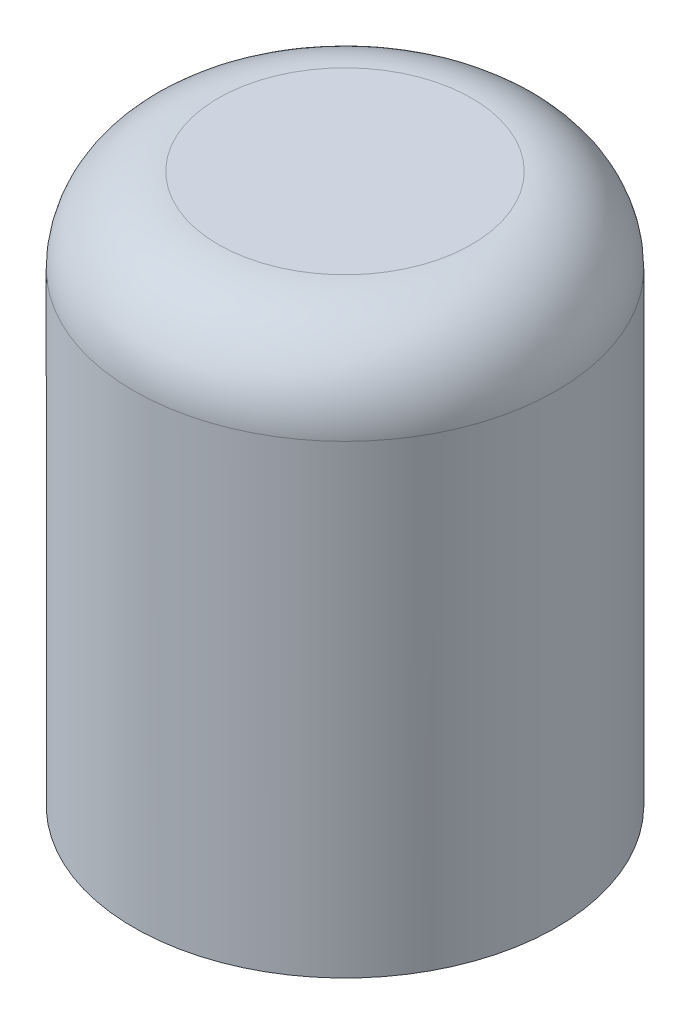
ISO-10303-21;
HEADER;
FILE_DESCRIPTION(('STEP AP214'),'2;1');
FILE_NAME('part.step','',(''),(''),'','','');
FILE_SCHEMA(('AUTOMOTIVE_DESIGN { 1 0 10303 214 1 1 1 1 }'));
ENDSEC;
DATA;
#1=APPLICATION_CONTEXT('core data for automotive mechanical design processes');
#2=APPLICATION_PROTOCOL_DEFINITION('international standard','automotive_design',2000,#1);
#3=PRODUCT_CONTEXT('',#1,'mechanical');
#4=PRODUCT('Part','Part','',(#3));
#5=PRODUCT_RELATED_PRODUCT_CATEGORY('part','',(#4));
#6=PRODUCT_DEFINITION_FORMATION('','',#4);
#7=PRODUCT_DEFINITION_CONTEXT('part definition',#1,'design');
#8=PRODUCT_DEFINITION('design','',#6,#7);
#9=PRODUCT_DEFINITION_SHAPE('','',#8);
#10=(LENGTH_UNIT() NAMED_UNIT(*) SI_UNIT(.MILLI.,.METRE.));
#11=(NAMED_UNIT(*) PLANE_ANGLE_UNIT() SI_UNIT($,.RADIAN.));
#12=(NAMED_UNIT(*) SI_UNIT($,.STERADIAN.) SOLID_ANGLE_UNIT());
#13=UNCERTAINTY_MEASURE_WITH_UNIT(LENGTH_MEASURE(1.E-05),#10,'distance_accuracy_value','');
#14=(GEOMETRIC_REPRESENTATION_CONTEXT(3) GLOBAL_UNCERTAINTY_ASSIGNED_CONTEXT((#13)) GLOBAL_UNIT_ASSIGNED_CONTEXT((#10,
#11,#12)) REPRESENTATION_CONTEXT('',''));
#15=CARTESIAN_POINT('',(0.,0.,0.));
#16=DIRECTION('',(0.,0.,1.));
#17=DIRECTION('',(1.,0.,0.));
#18=AXIS2_PLACEMENT_3D('',#15,#16,#17);
#19=CARTESIAN_POINT('',(0.,11.,0.));
#20=DIRECTION('',(0.,1.,0.));
#21=DIRECTION('',(0.,0.,1.));
#22=AXIS2_PLACEMENT_3D('',#19,#20,#21);
#23=TOROIDAL_SURFACE('',#22,3.,2.);
#24=CARTESIAN_POINT('',(0.,13.,0.));
#25=DIRECTION('',(0.,1.,0.));
#26=DIRECTION('',(0.,0.,1.));
#27=AXIS2_PLACEMENT_3D('',#24,#25,#26);
#28=CIRCLE('',#27,3.);
#29=CARTESIAN_POINT('',(0.,13.,3.));
#30=VERTEX_POINT('',#29);
#31=EDGE_CURVE('E40',#30,#30,#28,.T.);
#32=ORIENTED_EDGE('',*,*,#31,.F.);
#33=EDGE_LOOP('',(#32));
#34=FACE_BOUND('',#33,.T.);
#35=CARTESIAN_POINT('',(0.,11.,0.));
#36=DIRECTION('',(0.,1.,0.));
#37=DIRECTION('',(0.,0.,1.));
#38=AXIS2_PLACEMENT_3D('',#35,#36,#37);
#39=CIRCLE('',#38,5.);
#40=CARTESIAN_POINT('',(0.,11.,-5.));
#41=VERTEX_POINT('',#40);
#42=EDGE_CURVE('E11',#41,#41,#39,.F.);
#43=ORIENTED_EDGE('',*,*,#42,.F.);
#44=EDGE_LOOP('',(#43));
#45=FACE_BOUND('',#44,.T.);
#46=ADVANCED_FACE('F33',(#34,#45),#23,.T.);
#47=CARTESIAN_POINT('',(0.,0.5,0.));
#48=DIRECTION('',(0.,1.,0.));
#49=DIRECTION('',(0.,0.,1.));
#50=AXIS2_PLACEMENT_3D('',#47,#48,#49);
#51=TOROIDAL_SURFACE('',#50,3.75,0.5);
#52=CARTESIAN_POINT('',(-1.75,0.5,-2.73861278752583));
#53=CARTESIAN_POINT('',(-1.7499674824481,0.474278837361454,-2.73859259790002));
#54=CARTESIAN_POINT('',(-1.75198237506451,0.448586345650578,-2.73969859620781));
#55=CARTESIAN_POINT('',(-1.75984312267766,0.398079901109395,-2.74400024533714));
#56=CARTESIAN_POINT('',(-1.76567297405102,0.373262732662912,-2.74718716663568));
#57=CARTESIAN_POINT('',(-1.78089732230707,0.325121956256528,-2.75548689059487));
#58=CARTESIAN_POINT('',(-1.79028883460707,0.30179711683594,-2.76059808074036));
#59=CARTESIAN_POINT('',(-1.81223505767192,0.25713980788578,-2.77249719754774));
#60=CARTESIAN_POINT('',(-1.82479229547402,0.235808948784772,-2.7792864636469));
#61=CARTESIAN_POINT('',(-1.85332454478459,0.194533583680187,-2.79464403087261));
#62=CARTESIAN_POINT('',(-1.86944038713963,0.174713912089738,-2.80328498984528));
#63=CARTESIAN_POINT('',(-1.90413868768371,0.138036031663502,-2.82179051623727));
#64=CARTESIAN_POINT('',(-1.92272186476392,0.121178689281027,-2.83165544022016));
#65=CARTESIAN_POINT('',(-1.96413552071173,0.0888438232670606,-2.85351348382649));
#66=CARTESIAN_POINT('',(-1.98720861684694,0.0737543212637763,-2.86562069702042));
#67=CARTESIAN_POINT('',(-2.0351853803325,0.0476715458813287,-2.89062495299089));
#68=CARTESIAN_POINT('',(-2.06009049046738,0.0366815432797199,-2.90352261691614));
#69=CARTESIAN_POINT('',(-2.11141723205832,0.0188117444425454,-2.92991945103525));
#70=CARTESIAN_POINT('',(-2.13785298735995,0.0119805652929461,-2.94342382558038));
#71=CARTESIAN_POINT('',(-2.1913643035036,0.00271071457912047,-2.97056837485435));
#72=CARTESIAN_POINT('',(-2.21843834900099,0.00026252908381243,-2.98420819066613));
#73=CARTESIAN_POINT('',(-2.24701876895388,6.65253664002436E-06,-2.99850910914954));
#74=CARTESIAN_POINT('',(-2.24850938818204,-1.45989664626208E-08,-2.99925469676851));
#75=CARTESIAN_POINT('',(-2.25,0.,-3.));
#76=B_SPLINE_CURVE_WITH_KNOTS('',3,(#52,#53,#54,#55,#56,#57,#58,#59,#60,#61,#62,#63,#64,#65,#66,
#67,#68,#69,#70,#71,#72,#73,#74,#75),.UNSPECIFIED.,.F.,.F.,(4,2,2,2,2,2,2,2,2,2,2,4),(0.,
0.0770159881493257,0.153710950261179,0.230341785415904,0.307033985825627,0.387608331550511,
0.46820620542566,0.558170639044782,0.648206697860432,0.739276030919878,0.830147443841168,
0.835147483886677),.UNSPECIFIED.);
#77=CARTESIAN_POINT('',(-2.25,0.,-3.));
#78=VERTEX_POINT('',#77);
#79=CARTESIAN_POINT('',(-1.75,0.5,-2.73861278752583));
#80=VERTEX_POINT('',#79);
#81=EDGE_CURVE('E55',#78,#80,#76,.F.);
#82=ORIENTED_EDGE('',*,*,#81,.F.);
#83=CARTESIAN_POINT('',(0.,0.,0.));
#84=DIRECTION('',(0.,1.,0.));
#85=DIRECTION('',(0.,0.,1.));
#86=AXIS2_PLACEMENT_3D('',#83,#84,#85);
#87=CIRCLE('',#86,3.75);
#88=CARTESIAN_POINT('',(-2.25,0.,3.));
#89=VERTEX_POINT('',#88);
#90=EDGE_CURVE('E85',#89,#78,#87,.T.);
#91=ORIENTED_EDGE('',*,*,#90,.F.);
#92=CARTESIAN_POINT('',(-1.75,0.5,2.73861278752583));
#93=CARTESIAN_POINT('',(-1.7499674824481,0.474278837361454,2.73859259790002));
#94=CARTESIAN_POINT('',(-1.75198237506451,0.448586345650578,2.73969859620781));
#95=CARTESIAN_POINT('',(-1.75984312267766,0.398079901109395,2.74400024533714));
#96=CARTESIAN_POINT('',(-1.76567297405102,0.373262732662912,2.74718716663568));
#97=CARTESIAN_POINT('',(-1.78089732230707,0.325121956256528,2.75548689059487));
#98=CARTESIAN_POINT('',(-1.79028883460707,0.30179711683594,2.76059808074036));
#99=CARTESIAN_POINT('',(-1.81223505767192,0.25713980788578,2.77249719754774));
#100=CARTESIAN_POINT('',(-1.82479229547402,0.235808948784772,2.7792864636469));
#101=CARTESIAN_POINT('',(-1.85332454478459,0.194533583680187,2.79464403087261));
#102=CARTESIAN_POINT('',(-1.86944038713963,0.174713912089738,2.80328498984528));
#103=CARTESIAN_POINT('',(-1.90413868768371,0.138036031663502,2.82179051623727));
#104=CARTESIAN_POINT('',(-1.92272186476392,0.121178689281027,2.83165544022016));
#105=CARTESIAN_POINT('',(-1.96413552071173,0.0888438232670606,2.85351348382649));
#106=CARTESIAN_POINT('',(-1.98720861684694,0.0737543212637763,2.86562069702042));
#107=CARTESIAN_POINT('',(-2.0351853803325,0.0476715458813287,2.89062495299089));
#108=CARTESIAN_POINT('',(-2.06009049046738,0.0366815432797199,2.90352261691614));
#109=CARTESIAN_POINT('',(-2.11141723205832,0.0188117444425454,2.92991945103525));
#110=CARTESIAN_POINT('',(-2.13785298735995,0.0119805652929461,2.94342382558038));
#111=CARTESIAN_POINT('',(-2.1913643035036,0.00271071457912047,2.97056837485435));
#112=CARTESIAN_POINT('',(-2.21843834900099,0.00026252908381243,2.98420819066613));
#113=CARTESIAN_POINT('',(-2.24701876895388,6.65253664002436E-06,2.99850910914954));
#114=CARTESIAN_POINT('',(-2.24850938818204,-1.45989664626208E-08,2.99925469676851));
#115=CARTESIAN_POINT('',(-2.25,0.,3.));
#116=B_SPLINE_CURVE_WITH_KNOTS('',3,(#92,#93,#94,#95,#96,#97,#98,#99,#100,#101,#102,#103,#104,
#105,#106,#107,#108,#109,#110,#111,#112,#113,#114,#115),.UNSPECIFIED.,.F.,.F.,(4,2,2,2,2,2,2,2,
2,2,2,4),(0.,0.0770159881493257,0.153710950261179,0.230341785415904,0.307033985825627,
0.387608331550511,0.46820620542566,0.558170639044782,0.648206697860432,0.739276030919878,
0.830147443841168,0.835147483886677),.UNSPECIFIED.);
#117=CARTESIAN_POINT('',(-1.75,0.5,2.73861278752583));
#118=VERTEX_POINT('',#117);
#119=EDGE_CURVE('E47',#89,#118,#116,.F.);
#120=ORIENTED_EDGE('',*,*,#119,.T.);
#121=CARTESIAN_POINT('',(0.,0.5,0.));
#122=DIRECTION('',(0.,1.,0.));
#123=DIRECTION('',(0.,0.,1.));
#124=AXIS2_PLACEMENT_3D('',#121,#122,#123);
#125=CIRCLE('',#124,3.25);
#126=EDGE_CURVE('E105',#80,#118,#125,.F.);
#127=ORIENTED_EDGE('',*,*,#126,.F.);
#128=EDGE_LOOP('',(#82,#91,#120,#127));
#129=FACE_BOUND('',#128,.T.);
#130=ADVANCED_FACE('F128',(#129),#51,.T.);
#131=CARTESIAN_POINT('',(-2.25,0.5,0.));
#132=DIRECTION('',(0.,0.,1.));
#133=DIRECTION('',(1.,0.,0.));
#134=AXIS2_PLACEMENT_3D('',#131,#132,#133);
#135=CYLINDRICAL_SURFACE('',#134,0.5);
#136=DIRECTION('',(0.,0.,1.));
#137=VECTOR('',#136,1.);
#138=CARTESIAN_POINT('',(-2.25,0.,0.));
#139=LINE('',#138,#137);
#140=EDGE_CURVE('E241',#78,#89,#139,.T.);
#141=ORIENTED_EDGE('',*,*,#140,.F.);
#142=ORIENTED_EDGE('',*,*,#81,.T.);
#143=DIRECTION('',(0.,0.,1.));
#144=VECTOR('',#143,1.);
#145=CARTESIAN_POINT('',(-1.75,0.5,2.73861278752583));
#146=LINE('',#145,#144);
#147=EDGE_CURVE('E242',#118,#80,#146,.F.);
#148=ORIENTED_EDGE('',*,*,#147,.F.);
#149=ORIENTED_EDGE('',*,*,#119,.F.);
#150=EDGE_LOOP('',(#141,#142,#148,#149));
#151=FACE_BOUND('',#150,.T.);
#152=ADVANCED_FACE('F127',(#151),#135,.T.);
#153=CARTESIAN_POINT('',(0.25,10.,2.73861278752583));
#154=DIRECTION('',(0.,0.,1.));
#155=DIRECTION('',(1.,0.,0.));
#156=AXIS2_PLACEMENT_3D('',#153,#154,#155);
#157=CYLINDRICAL_SURFACE('',#156,2.);
#158=CARTESIAN_POINT('',(-1.75,10.,2.73861278752583));
#159=CARTESIAN_POINT('',(-1.75000816912058,10.0507790307986,2.73861468583138));
#160=CARTESIAN_POINT('',(-1.74806629696918,10.1015541531402,2.73755358747773));
#161=CARTESIAN_POINT('',(-1.74034467667038,10.2027120285179,2.73332073449254));
#162=CARTESIAN_POINT('',(-1.73456579461389,10.2530948675043,2.73014945617105));
#163=CARTESIAN_POINT('',(-1.71925648862986,10.3529491670645,2.72172487337152));
#164=CARTESIAN_POINT('',(-1.70973795382558,10.4024230008178,2.71647816674781));
#165=CARTESIAN_POINT('',(-1.68707759421614,10.5002555603041,2.70393632748552));
#166=CARTESIAN_POINT('',(-1.6739356944156,10.548614262934,2.69664115244826));
#167=CARTESIAN_POINT('',(-1.62930393841335,10.691475721789,2.67173957516339));
#168=CARTESIAN_POINT('',(-1.59258791588586,10.7838922129445,2.65110627863707));
#169=CARTESIAN_POINT('',(-1.50694306106797,10.9606354500445,2.6021960978917));
#170=CARTESIAN_POINT('',(-1.45800888862979,11.0449586363054,2.57391587100369));
#171=CARTESIAN_POINT('',(-1.34814040147741,11.2065713771222,2.50908490538744));
#172=CARTESIAN_POINT('',(-1.28684953721344,11.2835167292294,2.47228191665899));
#173=CARTESIAN_POINT('',(-1.15597627280254,11.4256854150547,2.39155965771705));
#174=CARTESIAN_POINT('',(-1.08639158752251,11.490905505728,2.34763842506353));
#175=CARTESIAN_POINT('',(-0.93425177888914,11.6149669654105,2.24843408945576));
#176=CARTESIAN_POINT('',(-0.851095848357129,11.6725104809852,2.19245298766746));
#177=CARTESIAN_POINT('',(-0.68125877312185,11.7727086286412,2.07300451830204));
#178=CARTESIAN_POINT('',(-0.594575082272912,11.8153522861475,2.00953167848326));
#179=CARTESIAN_POINT('',(-0.408883207647119,11.8913686311015,1.86614077914458));
#180=CARTESIAN_POINT('',(-0.309833761820723,11.9226340776535,1.78516289323326));
#181=CARTESIAN_POINT('',(-0.116055525435656,11.9687318844899,1.61415112026727));
#182=CARTESIAN_POINT('',(-0.0213227820591646,11.9835795807799,1.52412577046852));
#183=CARTESIAN_POINT('',(0.129674211255887,11.9973102065997,1.36566027483809));
#184=CARTESIAN_POINT('',(0.188367233854648,11.9998314593428,1.29982098277476));
#185=CARTESIAN_POINT('',(0.246186828178407,11.9999972893097,1.22940835715166));
#186=CARTESIAN_POINT('',(0.248095057446701,12.0000000118041,1.22707792876438));
#187=CARTESIAN_POINT('',(0.25,12.,1.22474487139159));
#188=B_SPLINE_CURVE_WITH_KNOTS('',3,(#158,#159,#160,#161,#162,#163,#164,#165,#166,#167,#168,
#169,#170,#171,#172,#173,#174,#175,#176,#177,#178,#179,#180,#181,#182,#183,#184,#185,#186,#187),
.UNSPECIFIED.,.F.,.F.,(4,2,2,2,2,2,2,2,2,2,2,2,2,2,4),(0.,0.152282242472667,0.304530123436235,
0.45629784378193,0.608068705608748,0.911224208590558,1.21451244342922,1.5282918691089,
1.84215794875556,2.18753619618074,2.53316830028833,2.92675582318251,3.31997538013147,
3.58426601727816,3.59330204984164),.UNSPECIFIED.);
#189=CARTESIAN_POINT('',(-1.75,10.,2.73861278752583));
#190=VERTEX_POINT('',#189);
#191=CARTESIAN_POINT('',(0.25,12.,1.22474487139159));
#192=VERTEX_POINT('',#191);
#193=EDGE_CURVE('E74',#190,#192,#188,.T.);
#194=ORIENTED_EDGE('',*,*,#193,.F.);
#195=DIRECTION('',(0.,0.,1.));
#196=VECTOR('',#195,1.);
#197=CARTESIAN_POINT('',(-1.75,10.,2.73861278752583));
#198=LINE('',#197,#196);
#199=CARTESIAN_POINT('',(-1.75,10.,-2.73861278752583));
#200=VERTEX_POINT('',#199);
#201=EDGE_CURVE('E77',#200,#190,#198,.T.);
#202=ORIENTED_EDGE('',*,*,#201,.F.);
#203=CARTESIAN_POINT('',(-1.75,10.,-2.73861278752583));
#204=CARTESIAN_POINT('',(-1.75000816912058,10.0507790307986,-2.73861468583138));
#205=CARTESIAN_POINT('',(-1.74806629696918,10.1015541531402,-2.73755358747773));
#206=CARTESIAN_POINT('',(-1.74034467667038,10.2027120285179,-2.73332073449254));
#207=CARTESIAN_POINT('',(-1.73456579461389,10.2530948675043,-2.73014945617105));
#208=CARTESIAN_POINT('',(-1.71925648862986,10.3529491670645,-2.72172487337152));
#209=CARTESIAN_POINT('',(-1.70973795382558,10.4024230008178,-2.71647816674781));
#210=CARTESIAN_POINT('',(-1.68707759421614,10.5002555603041,-2.70393632748552));
#211=CARTESIAN_POINT('',(-1.6739356944156,10.548614262934,-2.69664115244826));
#212=CARTESIAN_POINT('',(-1.62930393841335,10.691475721789,-2.67173957516339));
#213=CARTESIAN_POINT('',(-1.59258791588586,10.7838922129445,-2.65110627863707));
#214=CARTESIAN_POINT('',(-1.50694306106797,10.9606354500445,-2.6021960978917));
#215=CARTESIAN_POINT('',(-1.45800888862979,11.0449586363054,-2.57391587100369));
#216=CARTESIAN_POINT('',(-1.34814040147741,11.2065713771222,-2.50908490538744));
#217=CARTESIAN_POINT('',(-1.28684953721344,11.2835167292294,-2.47228191665899));
#218=CARTESIAN_POINT('',(-1.15597627280254,11.4256854150547,-2.39155965771705));
#219=CARTESIAN_POINT('',(-1.08639158752251,11.490905505728,-2.34763842506353));
#220=CARTESIAN_POINT('',(-0.93425177888914,11.6149669654105,-2.24843408945576));
#221=CARTESIAN_POINT('',(-0.851095848357129,11.6725104809852,-2.19245298766746));
#222=CARTESIAN_POINT('',(-0.68125877312185,11.7727086286412,-2.07300451830204));
#223=CARTESIAN_POINT('',(-0.594575082272912,11.8153522861475,-2.00953167848326));
#224=CARTESIAN_POINT('',(-0.408883207647119,11.8913686311015,-1.86614077914458));
#225=CARTESIAN_POINT('',(-0.309833761820723,11.9226340776535,-1.78516289323326));
#226=CARTESIAN_POINT('',(-0.116055525435656,11.9687318844899,-1.61415112026727));
#227=CARTESIAN_POINT('',(-0.0213227820591646,11.9835795807799,-1.52412577046852));
#228=CARTESIAN_POINT('',(0.129674211255887,11.9973102065997,-1.36566027483809));
#229=CARTESIAN_POINT('',(0.188367233854648,11.9998314593428,-1.29982098277476));
#230=CARTESIAN_POINT('',(0.246186828178407,11.9999972893097,-1.22940835715166));
#231=CARTESIAN_POINT('',(0.248095057446701,12.0000000118041,-1.22707792876438));
#232=CARTESIAN_POINT('',(0.25,12.,-1.22474487139159));
#233=B_SPLINE_CURVE_WITH_KNOTS('',3,(#203,#204,#205,#206,#207,#208,#209,#210,#211,#212,#213,
#214,#215,#216,#217,#218,#219,#220,#221,#222,#223,#224,#225,#226,#227,#228,#229,#230,#231,#232),
.UNSPECIFIED.,.F.,.F.,(4,2,2,2,2,2,2,2,2,2,2,2,2,2,4),(0.,0.152282242472667,0.304530123436235,
0.45629784378193,0.608068705608748,0.911224208590558,1.21451244342922,1.5282918691089,
1.84215794875556,2.18753619618074,2.53316830028833,2.92675582318251,3.31997538013147,
3.58426601727816,3.59330204984164),.UNSPECIFIED.);
#234=CARTESIAN_POINT('',(0.25,12.,-1.22474487139159));
#235=VERTEX_POINT('',#234);
#236=EDGE_CURVE('E86',#200,#235,#233,.T.);
#237=ORIENTED_EDGE('',*,*,#236,.T.);
#238=DIRECTION('',(0.,0.,1.));
#239=VECTOR('',#238,1.);
#240=CARTESIAN_POINT('',(0.25,12.,0.));
#241=LINE('',#240,#239);
#242=EDGE_CURVE('E80',#192,#235,#241,.F.);
#243=ORIENTED_EDGE('',*,*,#242,.F.);
#244=EDGE_LOOP('',(#194,#202,#237,#243));
#245=FACE_BOUND('',#244,.T.);
#246=ADVANCED_FACE('F76',(#245),#157,.F.);
#247=CARTESIAN_POINT('',(0.,10.,0.));
#248=DIRECTION('',(0.,-1.,0.));
#249=DIRECTION('',(0.,0.,-1.));
#250=AXIS2_PLACEMENT_3D('',#247,#248,#249);
#251=DEGENERATE_TOROIDAL_SURFACE('',#250,1.25,2.,.T.);
#252=CARTESIAN_POINT('',(0.,10.,0.));
#253=DIRECTION('',(0.,-1.,0.));
#254=DIRECTION('',(0.,0.,-1.));
#255=AXIS2_PLACEMENT_3D('',#252,#253,#254);
#256=CIRCLE('',#255,3.25);
#257=EDGE_CURVE('E99',#190,#200,#256,.F.);
#258=ORIENTED_EDGE('',*,*,#257,.F.);
#259=ORIENTED_EDGE('',*,*,#193,.T.);
#260=CARTESIAN_POINT('',(0.,12.,0.));
#261=DIRECTION('',(0.,-1.,0.));
#262=DIRECTION('',(0.,0.,-1.));
#263=AXIS2_PLACEMENT_3D('',#260,#261,#262);
#264=CIRCLE('',#263,1.25);
#265=EDGE_CURVE('E97',#235,#192,#264,.T.);
#266=ORIENTED_EDGE('',*,*,#265,.F.);
#267=ORIENTED_EDGE('',*,*,#236,.F.);
#268=EDGE_LOOP('',(#258,#259,#266,#267));
#269=FACE_BOUND('',#268,.T.);
#270=ADVANCED_FACE('F100',(#269),#251,.F.);
#271=CARTESIAN_POINT('',(0.,13.,0.));
#272=DIRECTION('',(0.,-1.,0.));
#273=DIRECTION('',(0.,0.,-1.));
#274=AXIS2_PLACEMENT_3D('',#271,#272,#273);
#275=CYLINDRICAL_SURFACE('',#274,5.);
#276=CARTESIAN_POINT('',(0.,0.,0.));
#277=DIRECTION('',(0.,1.,0.));
#278=DIRECTION('',(0.,0.,1.));
#279=AXIS2_PLACEMENT_3D('',#276,#277,#278);
#280=CIRCLE('',#279,5.);
#281=CARTESIAN_POINT('',(0.,0.,-5.));
#282=VERTEX_POINT('',#281);
#283=EDGE_CURVE('E102',#282,#282,#280,.T.);
#284=CARTESIAN_POINT('',(0.,11.,-5.));
#285=CARTESIAN_POINT('',(0.,10.8854166666667,-5.));
#286=CARTESIAN_POINT('',(0.,10.7708333333333,-5.));
#287=CARTESIAN_POINT('',(0.,10.5416666666667,-5.));
#288=CARTESIAN_POINT('',(0.,10.4270833333333,-5.));
#289=CARTESIAN_POINT('',(0.,10.1979166666667,-5.));
#290=CARTESIAN_POINT('',(0.,10.0833333333333,-5.));
#291=CARTESIAN_POINT('',(0.,9.85416666666667,-5.));
#292=CARTESIAN_POINT('',(0.,9.73958333333333,-5.));
#293=CARTESIAN_POINT('',(0.,9.51041666666667,-5.));
#294=CARTESIAN_POINT('',(0.,9.39583333333333,-5.));
#295=CARTESIAN_POINT('',(0.,9.16666666666666,-5.));
#296=CARTESIAN_POINT('',(0.,9.05208333333333,-5.));
#297=CARTESIAN_POINT('',(0.,8.82291666666666,-5.));
#298=CARTESIAN_POINT('',(0.,8.70833333333333,-5.));
#299=CARTESIAN_POINT('',(0.,8.47916666666666,-5.));
#300=CARTESIAN_POINT('',(0.,8.36458333333333,-5.));
#301=CARTESIAN_POINT('',(0.,8.13541666666667,-5.));
#302=CARTESIAN_POINT('',(0.,8.02083333333333,-5.));
#303=CARTESIAN_POINT('',(0.,7.79166666666667,-5.));
#304=CARTESIAN_POINT('',(0.,7.67708333333333,-5.));
#305=CARTESIAN_POINT('',(0.,7.44791666666667,-5.));
#306=CARTESIAN_POINT('',(0.,7.33333333333333,-5.));
#307=CARTESIAN_POINT('',(0.,7.10416666666667,-5.));
#308=CARTESIAN_POINT('',(0.,6.98958333333333,-5.));
#309=CARTESIAN_POINT('',(0.,6.76041666666667,-5.));
#310=CARTESIAN_POINT('',(0.,6.64583333333333,-5.));
#311=CARTESIAN_POINT('',(0.,6.41666666666667,-5.));
#312=CARTESIAN_POINT('',(0.,6.30208333333333,-5.));
#313=CARTESIAN_POINT('',(0.,6.07291666666667,-5.));
#314=CARTESIAN_POINT('',(0.,5.95833333333333,-5.));
#315=CARTESIAN_POINT('',(0.,5.72916666666667,-5.));
#316=CARTESIAN_POINT('',(0.,5.61458333333333,-5.));
#317=CARTESIAN_POINT('',(0.,5.38541666666667,-5.));
#318=CARTESIAN_POINT('',(0.,5.27083333333333,-5.));
#319=CARTESIAN_POINT('',(0.,5.04166666666667,-5.));
#320=CARTESIAN_POINT('',(0.,4.92708333333333,-5.));
#321=CARTESIAN_POINT('',(0.,4.69791666666667,-5.));
#322=CARTESIAN_POINT('',(0.,4.58333333333333,-5.));
#323=CARTESIAN_POINT('',(0.,4.35416666666667,-5.));
#324=CARTESIAN_POINT('',(0.,4.23958333333333,-5.));
#325=CARTESIAN_POINT('',(0.,4.01041666666667,-5.));
#326=CARTESIAN_POINT('',(0.,3.89583333333333,-5.));
#327=CARTESIAN_POINT('',(0.,3.66666666666667,-5.));
#328=CARTESIAN_POINT('',(0.,3.55208333333333,-5.));
#329=CARTESIAN_POINT('',(0.,3.32291666666667,-5.));
#330=CARTESIAN_POINT('',(0.,3.20833333333333,-5.));
#331=CARTESIAN_POINT('',(0.,2.97916666666667,-5.));
#332=CARTESIAN_POINT('',(0.,2.86458333333333,-5.));
#333=CARTESIAN_POINT('',(0.,2.63541666666667,-5.));
#334=CARTESIAN_POINT('',(0.,2.52083333333333,-5.));
#335=CARTESIAN_POINT('',(0.,2.29166666666667,-5.));
#336=CARTESIAN_POINT('',(0.,2.17708333333333,-5.));
#337=CARTESIAN_POINT('',(0.,1.94791666666667,-5.));
#338=CARTESIAN_POINT('',(0.,1.83333333333333,-5.));
#339=CARTESIAN_POINT('',(0.,1.60416666666667,-5.));
#340=CARTESIAN_POINT('',(0.,1.48958333333333,-5.));
#341=CARTESIAN_POINT('',(0.,1.26041666666667,-5.));
#342=CARTESIAN_POINT('',(0.,1.14583333333333,-5.));
#343=CARTESIAN_POINT('',(0.,0.916666666666666,-5.));
#344=CARTESIAN_POINT('',(0.,0.802083333333333,-5.));
#345=CARTESIAN_POINT('',(0.,0.572916666666667,-5.));
#346=CARTESIAN_POINT('',(0.,0.458333333333334,-5.));
#347=CARTESIAN_POINT('',(0.,0.229166666666667,-5.));
#348=CARTESIAN_POINT('',(0.,0.114583333333334,-5.));
#349=CARTESIAN_POINT('',(0.,0.,-5.));
#350=B_SPLINE_CURVE_WITH_KNOTS('',3,(#284,#285,#286,#287,#288,#289,#290,#291,#292,#293,#294,
#295,#296,#297,#298,#299,#300,#301,#302,#303,#304,#305,#306,#307,#308,#309,#310,#311,#312,#313,
#314,#315,#316,#317,#318,#319,#320,#321,#322,#323,#324,#325,#326,#327,#328,#329,#330,#331,#332,
#333,#334,#335,#336,#337,#338,#339,#340,#341,#342,#343,#344,#345,#346,#347,#348,#349),
.UNSPECIFIED.,.F.,.F.,(4,2,2,2,2,2,2,2,2,2,2,2,2,2,2,2,2,2,2,2,2,2,2,2,2,2,2,2,2,2,2,2,4),(0.,
0.343749999999999,0.687499999999999,1.03125,1.375,1.71875,2.0625,2.40625,2.75,3.09375,3.4375,
3.78125,4.125,4.46875,4.8125,5.15625,5.5,5.84375,6.1875,6.53125,6.875,7.21875,7.5625,7.90625,
8.25,8.59375,8.9375,9.28125,9.625,9.96875,10.3125,10.65625,11.),.UNSPECIFIED.);
#351=EDGE_CURVE('BSEAM152',#41,#282,#350,.T.);
#352=ORIENTED_EDGE('',*,*,#42,.T.);
#353=ORIENTED_EDGE('',*,*,#283,.T.);
#354=ORIENTED_EDGE('',*,*,#351,.T.);
#355=ORIENTED_EDGE('',*,*,#351,.F.);
#356=EDGE_LOOP('',(#352,#354,#353,#355));
#357=FACE_BOUND('',#356,.T.);
#358=ADVANCED_FACE('F152',(#357),#275,.T.);
#359=CARTESIAN_POINT('',(0.,13.,0.));
#360=DIRECTION('',(0.,1.,0.));
#361=DIRECTION('',(0.,0.,1.));
#362=AXIS2_PLACEMENT_3D('',#359,#360,#361);
#363=PLANE('',#362);
#364=ORIENTED_EDGE('',*,*,#31,.T.);
#365=EDGE_LOOP('',(#364));
#366=FACE_BOUND('',#365,.T.);
#367=ADVANCED_FACE('F146',(#366),#363,.T.);
#368=CARTESIAN_POINT('',(0.,0.,0.));
#369=DIRECTION('',(0.,1.,0.));
#370=DIRECTION('',(0.,0.,1.));
#371=AXIS2_PLACEMENT_3D('',#368,#369,#370);
#372=PLANE('',#371);
#373=ORIENTED_EDGE('',*,*,#90,.T.);
#374=ORIENTED_EDGE('',*,*,#140,.T.);
#375=EDGE_LOOP('',(#373,#374));
#376=FACE_BOUND('',#375,.T.);
#377=ORIENTED_EDGE('',*,*,#283,.F.);
#378=EDGE_LOOP('',(#377));
#379=FACE_BOUND('',#378,.T.);
#380=ADVANCED_FACE('F157',(#376,#379),#372,.F.);
#381=CARTESIAN_POINT('',(0.,12.,0.));
#382=DIRECTION('',(0.,-1.,0.));
#383=DIRECTION('',(0.,0.,-1.));
#384=AXIS2_PLACEMENT_3D('',#381,#382,#383);
#385=CYLINDRICAL_SURFACE('',#384,3.25);
#386=DIRECTION('',(0.,-1.,0.));
#387=VECTOR('',#386,1.);
#388=CARTESIAN_POINT('',(-1.75,12.,-2.73861278752583));
#389=LINE('',#388,#387);
#390=EDGE_CURVE('E96',#200,#80,#389,.T.);
#391=ORIENTED_EDGE('',*,*,#390,.T.);
#392=ORIENTED_EDGE('',*,*,#126,.T.);
#393=DIRECTION('',(0.,-1.,0.));
#394=VECTOR('',#393,1.);
#395=CARTESIAN_POINT('',(-1.75,12.,2.73861278752583));
#396=LINE('',#395,#394);
#397=EDGE_CURVE('E94',#190,#118,#396,.T.);
#398=ORIENTED_EDGE('',*,*,#397,.F.);
#399=ORIENTED_EDGE('',*,*,#257,.T.);
#400=EDGE_LOOP('',(#391,#392,#398,#399));
#401=FACE_BOUND('',#400,.T.);
#402=ADVANCED_FACE('F104',(#401),#385,.F.);
#403=CARTESIAN_POINT('',(-1.75,12.,2.73861278752583));
#404=DIRECTION('',(-1.,0.,0.));
#405=DIRECTION('',(0.,0.,1.));
#406=AXIS2_PLACEMENT_3D('',#403,#404,#405);
#407=PLANE('',#406);
#408=ORIENTED_EDGE('',*,*,#397,.T.);
#409=ORIENTED_EDGE('',*,*,#147,.T.);
#410=ORIENTED_EDGE('',*,*,#390,.F.);
#411=ORIENTED_EDGE('',*,*,#201,.T.);
#412=EDGE_LOOP('',(#408,#409,#410,#411));
#413=FACE_BOUND('',#412,.T.);
#414=ADVANCED_FACE('F91',(#413),#407,.F.);
#415=CARTESIAN_POINT('',(0.,12.,0.));
#416=DIRECTION('',(0.,-1.,0.));
#417=DIRECTION('',(0.,0.,-1.));
#418=AXIS2_PLACEMENT_3D('',#415,#416,#417);
#419=PLANE('',#418);
#420=ORIENTED_EDGE('',*,*,#242,.T.);
#421=ORIENTED_EDGE('',*,*,#265,.T.);
#422=EDGE_LOOP('',(#420,#421));
#423=FACE_BOUND('',#422,.T.);
#424=ADVANCED_FACE('F171',(#423),#419,.T.);
#425=CLOSED_SHELL('',(#46,#130,#152,#246,#270,#358,#367,#380,#402,#414,#424));
#426=MANIFOLD_SOLID_BREP('B2',#425);
#427=ADVANCED_BREP_SHAPE_REPRESENTATION('',(#18,#426),#14);
#428=SHAPE_DEFINITION_REPRESENTATION(#9,#427);
ENDSEC;
END-ISO-10303-21;
